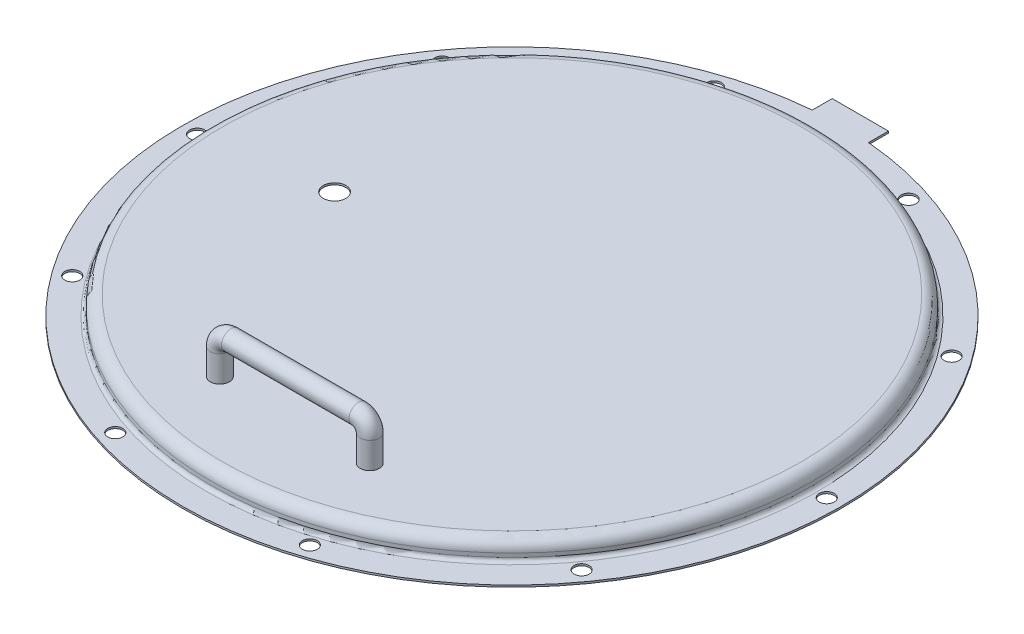
ISO-10303-21;
HEADER;
FILE_DESCRIPTION(('STEP AP214'),'2;1');
FILE_NAME('part.step','',(''),(''),'','','');
FILE_SCHEMA(('AUTOMOTIVE_DESIGN { 1 0 10303 214 1 1 1 1 }'));
ENDSEC;
DATA;
#1=APPLICATION_CONTEXT('core data for automotive mechanical design processes');
#2=APPLICATION_PROTOCOL_DEFINITION('international standard','automotive_design',2000,#1);
#3=PRODUCT_CONTEXT('',#1,'mechanical');
#4=PRODUCT('Part','Part','',(#3));
#5=PRODUCT_RELATED_PRODUCT_CATEGORY('part','',(#4));
#6=PRODUCT_DEFINITION_FORMATION('','',#4);
#7=PRODUCT_DEFINITION_CONTEXT('part definition',#1,'design');
#8=PRODUCT_DEFINITION('design','',#6,#7);
#9=PRODUCT_DEFINITION_SHAPE('','',#8);
#10=(LENGTH_UNIT() NAMED_UNIT(*) SI_UNIT(.MILLI.,.METRE.));
#11=(NAMED_UNIT(*) PLANE_ANGLE_UNIT() SI_UNIT($,.RADIAN.));
#12=(NAMED_UNIT(*) SI_UNIT($,.STERADIAN.) SOLID_ANGLE_UNIT());
#13=UNCERTAINTY_MEASURE_WITH_UNIT(LENGTH_MEASURE(1.E-05),#10,'distance_accuracy_value','');
#14=(GEOMETRIC_REPRESENTATION_CONTEXT(3) GLOBAL_UNCERTAINTY_ASSIGNED_CONTEXT((#13)) GLOBAL_UNIT_ASSIGNED_CONTEXT((#10,
#11,#12)) REPRESENTATION_CONTEXT('',''));
#15=CARTESIAN_POINT('',(0.,0.,0.));
#16=DIRECTION('',(0.,0.,1.));
#17=DIRECTION('',(1.,0.,0.));
#18=AXIS2_PLACEMENT_3D('',#15,#16,#17);
#19=CARTESIAN_POINT('',(200.,55.,579.2));
#20=DIRECTION('',(0.,1.,0.));
#21=DIRECTION('',(-1.,0.,0.));
#22=AXIS2_PLACEMENT_3D('',#19,#20,#21);
#23=PLANE('',#22);
#24=CARTESIAN_POINT('',(200.,55.,579.2));
#25=DIRECTION('',(0.,1.,0.));
#26=DIRECTION('',(-1.,0.,0.));
#27=AXIS2_PLACEMENT_3D('',#24,#25,#26);
#28=CIRCLE('',#27,25.4);
#29=CARTESIAN_POINT('',(174.6,55.,579.2));
#30=VERTEX_POINT('',#29);
#31=EDGE_CURVE('E68',#30,#30,#28,.T.);
#32=ORIENTED_EDGE('',*,*,#31,.F.);
#33=EDGE_LOOP('',(#32));
#34=FACE_BOUND('',#33,.T.);
#35=ADVANCED_FACE('F46',(#34),#23,.F.);
#36=CARTESIAN_POINT('',(-200.,55.,579.2));
#37=DIRECTION('',(0.,-1.,0.));
#38=DIRECTION('',(1.,0.,0.));
#39=AXIS2_PLACEMENT_3D('',#36,#37,#38);
#40=PLANE('',#39);
#41=CARTESIAN_POINT('',(-200.,55.,579.2));
#42=DIRECTION('',(0.,-1.,0.));
#43=DIRECTION('',(1.,0.,0.));
#44=AXIS2_PLACEMENT_3D('',#41,#42,#43);
#45=CIRCLE('',#44,25.4);
#46=CARTESIAN_POINT('',(-174.6,55.,579.2));
#47=VERTEX_POINT('',#46);
#48=EDGE_CURVE('E11',#47,#47,#45,.T.);
#49=ORIENTED_EDGE('',*,*,#48,.T.);
#50=EDGE_LOOP('',(#49));
#51=FACE_BOUND('',#50,.T.);
#52=ADVANCED_FACE('F75',(#51),#40,.T.);
#53=CARTESIAN_POINT('',(200.,55.,579.2));
#54=DIRECTION('',(0.,1.,0.));
#55=DIRECTION('',(0.,0.,1.));
#56=AXIS2_PLACEMENT_3D('',#53,#54,#55);
#57=CYLINDRICAL_SURFACE('',#56,25.4);
#58=CARTESIAN_POINT('',(200.,125.,579.2));
#59=DIRECTION('',(0.,1.,0.));
#60=DIRECTION('',(-1.,0.,0.));
#61=AXIS2_PLACEMENT_3D('',#58,#59,#60);
#62=CIRCLE('',#61,25.4);
#63=CARTESIAN_POINT('',(225.4,125.,579.2));
#64=VERTEX_POINT('',#63);
#65=EDGE_CURVE('E65',#64,#64,#62,.T.);
#66=ORIENTED_EDGE('',*,*,#65,.F.);
#67=EDGE_LOOP('',(#66));
#68=FACE_BOUND('',#67,.T.);
#69=ORIENTED_EDGE('',*,*,#31,.T.);
#70=EDGE_LOOP('',(#69));
#71=FACE_BOUND('',#70,.T.);
#72=ADVANCED_FACE('F72',(#68,#71),#57,.T.);
#73=CARTESIAN_POINT('',(170.,125.,579.2));
#74=DIRECTION('',(0.,0.,1.));
#75=DIRECTION('',(1.,0.,0.));
#76=AXIS2_PLACEMENT_3D('',#73,#74,#75);
#77=TOROIDAL_SURFACE('',#76,29.9999999999996,25.4);
#78=CARTESIAN_POINT('',(170.,155.,579.2));
#79=DIRECTION('',(-1.,0.,0.));
#80=DIRECTION('',(0.,-1.,0.));
#81=AXIS2_PLACEMENT_3D('',#78,#79,#80);
#82=CIRCLE('',#81,25.4);
#83=CARTESIAN_POINT('',(170.,180.4,579.2));
#84=VERTEX_POINT('',#83);
#85=EDGE_CURVE('E60',#84,#84,#82,.T.);
#86=CARTESIAN_POINT('',(170.,125.,579.2));
#87=DIRECTION('',(0.,0.,1.));
#88=DIRECTION('',(1.,0.,0.));
#89=AXIS2_PLACEMENT_3D('',#86,#87,#88);
#90=CIRCLE('',#89,55.3999999999996);
#91=EDGE_CURVE('',#64,#84,#90,.T.);
#92=ORIENTED_EDGE('',*,*,#65,.T.);
#93=ORIENTED_EDGE('',*,*,#85,.F.);
#94=ORIENTED_EDGE('',*,*,#91,.T.);
#95=ORIENTED_EDGE('',*,*,#91,.F.);
#96=EDGE_LOOP('',(#92,#94,#93,#95));
#97=FACE_BOUND('',#96,.T.);
#98=ADVANCED_FACE('F93',(#97),#77,.T.);
#99=CARTESIAN_POINT('',(170.,155.,579.2));
#100=DIRECTION('',(-1.,0.,0.));
#101=DIRECTION('',(0.,-1.,0.));
#102=AXIS2_PLACEMENT_3D('',#99,#100,#101);
#103=CYLINDRICAL_SURFACE('',#102,25.4);
#104=CARTESIAN_POINT('',(-170.,155.,579.2));
#105=DIRECTION('',(-1.,0.,0.));
#106=DIRECTION('',(0.,-1.,0.));
#107=AXIS2_PLACEMENT_3D('',#104,#105,#106);
#108=CIRCLE('',#107,25.4);
#109=CARTESIAN_POINT('',(-170.,180.4,579.2));
#110=VERTEX_POINT('',#109);
#111=EDGE_CURVE('E56',#110,#110,#108,.T.);
#112=ORIENTED_EDGE('',*,*,#111,.F.);
#113=EDGE_LOOP('',(#112));
#114=FACE_BOUND('',#113,.T.);
#115=ORIENTED_EDGE('',*,*,#85,.T.);
#116=EDGE_LOOP('',(#115));
#117=FACE_BOUND('',#116,.T.);
#118=ADVANCED_FACE('F87',(#114,#117),#103,.T.);
#119=CARTESIAN_POINT('',(-170.,125.,579.2));
#120=DIRECTION('',(0.,0.,1.));
#121=DIRECTION('',(1.,0.,0.));
#122=AXIS2_PLACEMENT_3D('',#119,#120,#121);
#123=TOROIDAL_SURFACE('',#122,30.,25.4);
#124=CARTESIAN_POINT('',(-200.,125.,579.2));
#125=DIRECTION('',(0.,-1.,0.));
#126=DIRECTION('',(1.,0.,0.));
#127=AXIS2_PLACEMENT_3D('',#124,#125,#126);
#128=CIRCLE('',#127,25.4);
#129=CARTESIAN_POINT('',(-225.4,125.,579.2));
#130=VERTEX_POINT('',#129);
#131=EDGE_CURVE('E52',#130,#130,#128,.T.);
#132=CARTESIAN_POINT('',(-170.,125.,579.2));
#133=DIRECTION('',(0.,0.,1.));
#134=DIRECTION('',(1.,0.,0.));
#135=AXIS2_PLACEMENT_3D('',#132,#133,#134);
#136=CIRCLE('',#135,55.4);
#137=EDGE_CURVE('',#110,#130,#136,.T.);
#138=ORIENTED_EDGE('',*,*,#111,.T.);
#139=ORIENTED_EDGE('',*,*,#131,.F.);
#140=ORIENTED_EDGE('',*,*,#137,.T.);
#141=ORIENTED_EDGE('',*,*,#137,.F.);
#142=EDGE_LOOP('',(#138,#140,#139,#141));
#143=FACE_BOUND('',#142,.T.);
#144=ADVANCED_FACE('F81',(#143),#123,.T.);
#145=CARTESIAN_POINT('',(-200.,125.,579.2));
#146=DIRECTION('',(0.,-1.,0.));
#147=DIRECTION('',(1.,0.,0.));
#148=AXIS2_PLACEMENT_3D('',#145,#146,#147);
#149=CYLINDRICAL_SURFACE('',#148,25.4);
#150=ORIENTED_EDGE('',*,*,#48,.F.);
#151=EDGE_LOOP('',(#150));
#152=FACE_BOUND('',#151,.T.);
#153=ORIENTED_EDGE('',*,*,#131,.T.);
#154=EDGE_LOOP('',(#153));
#155=FACE_BOUND('',#154,.T.);
#156=ADVANCED_FACE('F79',(#152,#155),#149,.T.);
#157=CLOSED_SHELL('',(#35,#52,#72,#98,#118,#144,#156));
#158=MANIFOLD_SOLID_BREP('B2',#157);
#159=CARTESIAN_POINT('',(0.,5.,0.));
#160=DIRECTION('',(0.,1.,0.));
#161=DIRECTION('',(0.,0.,1.));
#162=AXIS2_PLACEMENT_3D('',#159,#160,#161);
#163=PLANE('',#162);
#164=CARTESIAN_POINT('',(0.,5.,0.));
#165=DIRECTION('',(0.,1.,0.));
#166=DIRECTION('',(0.,0.,1.));
#167=AXIS2_PLACEMENT_3D('',#164,#165,#166);
#168=CIRCLE('',#167,813.);
#169=CARTESIAN_POINT('',(0.,5.,813.));
#170=VERTEX_POINT('',#169);
#171=EDGE_CURVE('E44',#170,#170,#168,.F.);
#172=ORIENTED_EDGE('',*,*,#171,.T.);
#173=EDGE_LOOP('',(#172));
#174=FACE_BOUND('',#173,.T.);
#175=CARTESIAN_POINT('',(259.450668477215,5.,-798.507051081408));
#176=DIRECTION('',(0.,1.,0.));
#177=DIRECTION('',(0.,0.,1.));
#178=AXIS2_PLACEMENT_3D('',#175,#176,#177);
#179=CIRCLE('',#178,20.0000000000001);
#180=CARTESIAN_POINT('',(259.450668477215,5.,-778.507051081408));
#181=VERTEX_POINT('',#180);
#182=EDGE_CURVE('E322',#181,#181,#179,.T.);
#183=ORIENTED_EDGE('',*,*,#182,.F.);
#184=EDGE_LOOP('',(#183));
#185=FACE_BOUND('',#184,.T.);
#186=CARTESIAN_POINT('',(-679.250668477202,5.,-493.504497824766));
#187=DIRECTION('',(0.,1.,0.));
#188=DIRECTION('',(0.,0.,1.));
#189=AXIS2_PLACEMENT_3D('',#186,#187,#188);
#190=CIRCLE('',#189,20.0000000000001);
#191=CARTESIAN_POINT('',(-679.250668477202,5.,-473.504497824766));
#192=VERTEX_POINT('',#191);
#193=EDGE_CURVE('E330',#192,#192,#190,.T.);
#194=ORIENTED_EDGE('',*,*,#193,.F.);
#195=EDGE_LOOP('',(#194));
#196=FACE_BOUND('',#195,.T.);
#197=CARTESIAN_POINT('',(-679.250668477209,5.,493.504497824757));
#198=DIRECTION('',(0.,1.,0.));
#199=DIRECTION('',(0.,0.,1.));
#200=AXIS2_PLACEMENT_3D('',#197,#198,#199);
#201=CIRCLE('',#200,20.0000000000001);
#202=CARTESIAN_POINT('',(-679.250668477209,5.,513.504497824757));
#203=VERTEX_POINT('',#202);
#204=EDGE_CURVE('E338',#203,#203,#201,.T.);
#205=ORIENTED_EDGE('',*,*,#204,.F.);
#206=EDGE_LOOP('',(#205));
#207=FACE_BOUND('',#206,.T.);
#208=CARTESIAN_POINT('',(259.450668477204,5.,798.507051081412));
#209=DIRECTION('',(0.,1.,0.));
#210=DIRECTION('',(0.,0.,1.));
#211=AXIS2_PLACEMENT_3D('',#208,#209,#210);
#212=CIRCLE('',#211,20.);
#213=CARTESIAN_POINT('',(259.450668477204,5.,818.507051081412));
#214=VERTEX_POINT('',#213);
#215=EDGE_CURVE('E346',#214,#214,#212,.T.);
#216=ORIENTED_EDGE('',*,*,#215,.F.);
#217=EDGE_LOOP('',(#216));
#218=FACE_BOUND('',#217,.T.);
#219=CARTESIAN_POINT('',(839.6,5.,0.));
#220=DIRECTION('',(0.,1.,0.));
#221=DIRECTION('',(0.,0.,1.));
#222=AXIS2_PLACEMENT_3D('',#219,#220,#221);
#223=CIRCLE('',#222,20.0000000000001);
#224=CARTESIAN_POINT('',(839.6,5.,20.0000000000001));
#225=VERTEX_POINT('',#224);
#226=EDGE_CURVE('E354',#225,#225,#223,.T.);
#227=ORIENTED_EDGE('',*,*,#226,.F.);
#228=EDGE_LOOP('',(#227));
#229=FACE_BOUND('',#228,.T.);
#230=DIRECTION('',(0.,0.,-1.));
#231=VECTOR('',#230,1.);
#232=CARTESIAN_POINT('',(75.0000000000001,5.,-875.995228297506));
#233=LINE('',#232,#231);
#234=CARTESIAN_POINT('',(74.9999999999993,5.,-875.995228297506));
#235=VERTEX_POINT('',#234);
#236=CARTESIAN_POINT('',(75.0000000000001,5.,-929.2));
#237=VERTEX_POINT('',#236);
#238=EDGE_CURVE('E199',#235,#237,#233,.T.);
#239=ORIENTED_EDGE('',*,*,#238,.T.);
#240=DIRECTION('',(-1.,0.,0.));
#241=VECTOR('',#240,1.);
#242=CARTESIAN_POINT('',(-74.9999999999999,5.,-929.2));
#243=LINE('',#242,#241);
#244=CARTESIAN_POINT('',(-74.9999999999999,5.,-929.2));
#245=VERTEX_POINT('',#244);
#246=EDGE_CURVE('E194',#237,#245,#243,.T.);
#247=ORIENTED_EDGE('',*,*,#246,.T.);
#248=DIRECTION('',(0.,0.,1.));
#249=VECTOR('',#248,1.);
#250=CARTESIAN_POINT('',(-74.9999999999999,5.,-875.995228297506));
#251=LINE('',#250,#249);
#252=CARTESIAN_POINT('',(-74.9999999999999,5.,-875.995228297506));
#253=VERTEX_POINT('',#252);
#254=EDGE_CURVE('E197',#245,#253,#251,.T.);
#255=ORIENTED_EDGE('',*,*,#254,.T.);
#256=CARTESIAN_POINT('',(0.,5.,0.));
#257=DIRECTION('',(0.,1.,0.));
#258=DIRECTION('',(0.,0.,1.));
#259=AXIS2_PLACEMENT_3D('',#256,#257,#258);
#260=CIRCLE('',#259,879.2);
#261=EDGE_CURVE('E163',#253,#235,#260,.T.);
#262=ORIENTED_EDGE('',*,*,#261,.T.);
#263=EDGE_LOOP('',(#239,#247,#255,#262));
#264=FACE_BOUND('',#263,.T.);
#265=CARTESIAN_POINT('',(679.250668477205,5.,493.504497824761));
#266=DIRECTION('',(0.,1.,0.));
#267=DIRECTION('',(0.,0.,1.));
#268=AXIS2_PLACEMENT_3D('',#265,#266,#267);
#269=CIRCLE('',#268,20.0000000000001);
#270=CARTESIAN_POINT('',(679.250668477205,5.,513.504497824762));
#271=VERTEX_POINT('',#270);
#272=EDGE_CURVE('E350',#271,#271,#269,.T.);
#273=ORIENTED_EDGE('',*,*,#272,.F.);
#274=EDGE_LOOP('',(#273));
#275=FACE_BOUND('',#274,.T.);
#276=CARTESIAN_POINT('',(-259.450668477209,5.,798.50705108141));
#277=DIRECTION('',(0.,1.,0.));
#278=DIRECTION('',(0.,0.,1.));
#279=AXIS2_PLACEMENT_3D('',#276,#277,#278);
#280=CIRCLE('',#279,20.0000000000001);
#281=CARTESIAN_POINT('',(-259.450668477209,5.,818.50705108141));
#282=VERTEX_POINT('',#281);
#283=EDGE_CURVE('E342',#282,#282,#280,.T.);
#284=ORIENTED_EDGE('',*,*,#283,.F.);
#285=EDGE_LOOP('',(#284));
#286=FACE_BOUND('',#285,.T.);
#287=CARTESIAN_POINT('',(-839.6,5.,-5.86289546418539E-12));
#288=DIRECTION('',(0.,1.,0.));
#289=DIRECTION('',(0.,0.,1.));
#290=AXIS2_PLACEMENT_3D('',#287,#288,#289);
#291=CIRCLE('',#290,20.);
#292=CARTESIAN_POINT('',(-839.6,5.,19.9999999999942));
#293=VERTEX_POINT('',#292);
#294=EDGE_CURVE('E334',#293,#293,#291,.T.);
#295=ORIENTED_EDGE('',*,*,#294,.F.);
#296=EDGE_LOOP('',(#295));
#297=FACE_BOUND('',#296,.T.);
#298=CARTESIAN_POINT('',(-259.450668477198,5.,-798.507051081413));
#299=DIRECTION('',(0.,1.,0.));
#300=DIRECTION('',(0.,0.,1.));
#301=AXIS2_PLACEMENT_3D('',#298,#299,#300);
#302=CIRCLE('',#301,20.0000000000002);
#303=CARTESIAN_POINT('',(-259.450668477198,5.,-778.507051081413));
#304=VERTEX_POINT('',#303);
#305=EDGE_CURVE('E326',#304,#304,#302,.T.);
#306=ORIENTED_EDGE('',*,*,#305,.F.);
#307=EDGE_LOOP('',(#306));
#308=FACE_BOUND('',#307,.T.);
#309=CARTESIAN_POINT('',(679.250668477212,5.,-493.504497824752));
#310=DIRECTION('',(0.,1.,0.));
#311=DIRECTION('',(0.,0.,1.));
#312=AXIS2_PLACEMENT_3D('',#309,#310,#311);
#313=CIRCLE('',#312,20.);
#314=CARTESIAN_POINT('',(679.250668477212,5.,-473.504497824752));
#315=VERTEX_POINT('',#314);
#316=EDGE_CURVE('E313',#315,#315,#313,.T.);
#317=ORIENTED_EDGE('',*,*,#316,.F.);
#318=EDGE_LOOP('',(#317));
#319=FACE_BOUND('',#318,.T.);
#320=ADVANCED_FACE('F146',(#174,#185,#196,#207,#218,#229,#264,#275,#286,#297,#308,#319),#163,.T.);
#321=CARTESIAN_POINT('',(0.,0.,0.));
#322=DIRECTION('',(0.,1.,0.));
#323=DIRECTION('',(0.,0.,1.));
#324=AXIS2_PLACEMENT_3D('',#321,#322,#323);
#325=PLANE('',#324);
#326=DIRECTION('',(0.,0.,-1.));
#327=VECTOR('',#326,1.);
#328=CARTESIAN_POINT('',(75.0000000000001,0.,-875.995228297506));
#329=LINE('',#328,#327);
#330=CARTESIAN_POINT('',(74.9999999999993,0.,-875.995228297506));
#331=VERTEX_POINT('',#330);
#332=CARTESIAN_POINT('',(75.0000000000001,0.,-929.2));
#333=VERTEX_POINT('',#332);
#334=EDGE_CURVE('E214',#331,#333,#329,.T.);
#335=ORIENTED_EDGE('',*,*,#334,.F.);
#336=CARTESIAN_POINT('',(0.,0.,0.));
#337=DIRECTION('',(0.,1.,0.));
#338=DIRECTION('',(0.,0.,1.));
#339=AXIS2_PLACEMENT_3D('',#336,#337,#338);
#340=CIRCLE('',#339,879.2);
#341=CARTESIAN_POINT('',(-74.9999999999999,0.,-875.995228297506));
#342=VERTEX_POINT('',#341);
#343=EDGE_CURVE('E186',#342,#331,#340,.T.);
#344=ORIENTED_EDGE('',*,*,#343,.F.);
#345=DIRECTION('',(0.,0.,1.));
#346=VECTOR('',#345,1.);
#347=CARTESIAN_POINT('',(-74.9999999999999,0.,-875.995228297506));
#348=LINE('',#347,#346);
#349=CARTESIAN_POINT('',(-74.9999999999999,0.,-929.2));
#350=VERTEX_POINT('',#349);
#351=EDGE_CURVE('E180',#350,#342,#348,.T.);
#352=ORIENTED_EDGE('',*,*,#351,.F.);
#353=DIRECTION('',(-1.,0.,0.));
#354=VECTOR('',#353,1.);
#355=CARTESIAN_POINT('',(-74.9999999999999,0.,-929.2));
#356=LINE('',#355,#354);
#357=EDGE_CURVE('E204',#333,#350,#356,.T.);
#358=ORIENTED_EDGE('',*,*,#357,.F.);
#359=EDGE_LOOP('',(#335,#344,#352,#358));
#360=FACE_BOUND('',#359,.T.);
#361=CARTESIAN_POINT('',(0.,0.,0.));
#362=DIRECTION('',(0.,1.,0.));
#363=DIRECTION('',(0.,0.,1.));
#364=AXIS2_PLACEMENT_3D('',#361,#362,#363);
#365=CIRCLE('',#364,800.);
#366=CARTESIAN_POINT('',(0.,0.,800.));
#367=VERTEX_POINT('',#366);
#368=EDGE_CURVE('E217',#367,#367,#365,.T.);
#369=ORIENTED_EDGE('',*,*,#368,.T.);
#370=EDGE_LOOP('',(#369));
#371=FACE_BOUND('',#370,.T.);
#372=CARTESIAN_POINT('',(839.6,0.,0.));
#373=DIRECTION('',(0.,1.,0.));
#374=DIRECTION('',(0.,0.,1.));
#375=AXIS2_PLACEMENT_3D('',#372,#373,#374);
#376=CIRCLE('',#375,20.0000000000001);
#377=CARTESIAN_POINT('',(839.6,0.,20.0000000000001));
#378=VERTEX_POINT('',#377);
#379=EDGE_CURVE('E276',#378,#378,#376,.T.);
#380=ORIENTED_EDGE('',*,*,#379,.T.);
#381=EDGE_LOOP('',(#380));
#382=FACE_BOUND('',#381,.T.);
#383=CARTESIAN_POINT('',(679.250668477205,0.,493.504497824761));
#384=DIRECTION('',(0.,1.,0.));
#385=DIRECTION('',(0.,0.,1.));
#386=AXIS2_PLACEMENT_3D('',#383,#384,#385);
#387=CIRCLE('',#386,20.0000000000001);
#388=CARTESIAN_POINT('',(679.250668477205,0.,513.504497824762));
#389=VERTEX_POINT('',#388);
#390=EDGE_CURVE('E280',#389,#389,#387,.T.);
#391=ORIENTED_EDGE('',*,*,#390,.T.);
#392=EDGE_LOOP('',(#391));
#393=FACE_BOUND('',#392,.T.);
#394=CARTESIAN_POINT('',(259.450668477204,0.,798.507051081412));
#395=DIRECTION('',(0.,1.,0.));
#396=DIRECTION('',(0.,0.,1.));
#397=AXIS2_PLACEMENT_3D('',#394,#395,#396);
#398=CIRCLE('',#397,20.);
#399=CARTESIAN_POINT('',(259.450668477204,0.,818.507051081412));
#400=VERTEX_POINT('',#399);
#401=EDGE_CURVE('E284',#400,#400,#398,.T.);
#402=ORIENTED_EDGE('',*,*,#401,.T.);
#403=EDGE_LOOP('',(#402));
#404=FACE_BOUND('',#403,.T.);
#405=CARTESIAN_POINT('',(-259.450668477209,0.,798.50705108141));
#406=DIRECTION('',(0.,1.,0.));
#407=DIRECTION('',(0.,0.,1.));
#408=AXIS2_PLACEMENT_3D('',#405,#406,#407);
#409=CIRCLE('',#408,20.0000000000001);
#410=CARTESIAN_POINT('',(-259.450668477209,0.,818.50705108141));
#411=VERTEX_POINT('',#410);
#412=EDGE_CURVE('E288',#411,#411,#409,.T.);
#413=ORIENTED_EDGE('',*,*,#412,.T.);
#414=EDGE_LOOP('',(#413));
#415=FACE_BOUND('',#414,.T.);
#416=CARTESIAN_POINT('',(-679.250668477209,0.,493.504497824757));
#417=DIRECTION('',(0.,1.,0.));
#418=DIRECTION('',(0.,0.,1.));
#419=AXIS2_PLACEMENT_3D('',#416,#417,#418);
#420=CIRCLE('',#419,20.0000000000001);
#421=CARTESIAN_POINT('',(-679.250668477209,0.,513.504497824757));
#422=VERTEX_POINT('',#421);
#423=EDGE_CURVE('E292',#422,#422,#420,.T.);
#424=ORIENTED_EDGE('',*,*,#423,.T.);
#425=EDGE_LOOP('',(#424));
#426=FACE_BOUND('',#425,.T.);
#427=CARTESIAN_POINT('',(-839.6,0.,-5.86289546418539E-12));
#428=DIRECTION('',(0.,1.,0.));
#429=DIRECTION('',(0.,0.,1.));
#430=AXIS2_PLACEMENT_3D('',#427,#428,#429);
#431=CIRCLE('',#430,20.);
#432=CARTESIAN_POINT('',(-839.6,0.,19.9999999999942));
#433=VERTEX_POINT('',#432);
#434=EDGE_CURVE('E296',#433,#433,#431,.T.);
#435=ORIENTED_EDGE('',*,*,#434,.T.);
#436=EDGE_LOOP('',(#435));
#437=FACE_BOUND('',#436,.T.);
#438=CARTESIAN_POINT('',(-679.250668477202,0.,-493.504497824766));
#439=DIRECTION('',(0.,1.,0.));
#440=DIRECTION('',(0.,0.,1.));
#441=AXIS2_PLACEMENT_3D('',#438,#439,#440);
#442=CIRCLE('',#441,20.0000000000001);
#443=CARTESIAN_POINT('',(-679.250668477202,0.,-473.504497824766));
#444=VERTEX_POINT('',#443);
#445=EDGE_CURVE('E300',#444,#444,#442,.T.);
#446=ORIENTED_EDGE('',*,*,#445,.T.);
#447=EDGE_LOOP('',(#446));
#448=FACE_BOUND('',#447,.T.);
#449=CARTESIAN_POINT('',(-259.450668477198,0.,-798.507051081413));
#450=DIRECTION('',(0.,1.,0.));
#451=DIRECTION('',(0.,0.,1.));
#452=AXIS2_PLACEMENT_3D('',#449,#450,#451);
#453=CIRCLE('',#452,20.0000000000002);
#454=CARTESIAN_POINT('',(-259.450668477198,0.,-778.507051081413));
#455=VERTEX_POINT('',#454);
#456=EDGE_CURVE('E304',#455,#455,#453,.T.);
#457=ORIENTED_EDGE('',*,*,#456,.T.);
#458=EDGE_LOOP('',(#457));
#459=FACE_BOUND('',#458,.T.);
#460=CARTESIAN_POINT('',(259.450668477215,0.,-798.507051081408));
#461=DIRECTION('',(0.,1.,0.));
#462=DIRECTION('',(0.,0.,1.));
#463=AXIS2_PLACEMENT_3D('',#460,#461,#462);
#464=CIRCLE('',#463,20.0000000000001);
#465=CARTESIAN_POINT('',(259.450668477215,0.,-778.507051081408));
#466=VERTEX_POINT('',#465);
#467=EDGE_CURVE('E308',#466,#466,#464,.T.);
#468=ORIENTED_EDGE('',*,*,#467,.T.);
#469=EDGE_LOOP('',(#468));
#470=FACE_BOUND('',#469,.T.);
#471=CARTESIAN_POINT('',(679.250668477212,0.,-493.504497824752));
#472=DIRECTION('',(0.,1.,0.));
#473=DIRECTION('',(0.,0.,1.));
#474=AXIS2_PLACEMENT_3D('',#471,#472,#473);
#475=CIRCLE('',#474,20.);
#476=CARTESIAN_POINT('',(679.250668477212,0.,-473.504497824752));
#477=VERTEX_POINT('',#476);
#478=EDGE_CURVE('E311',#477,#477,#475,.T.);
#479=ORIENTED_EDGE('',*,*,#478,.T.);
#480=EDGE_LOOP('',(#479));
#481=FACE_BOUND('',#480,.T.);
#482=ADVANCED_FACE('F244',(#360,#371,#382,#393,#404,#415,#426,#437,#448,#459,#470,#481),#325,.F.);
#483=CARTESIAN_POINT('',(75.0000000000001,5.,-875.995228297506));
#484=DIRECTION('',(-1.,0.,0.));
#485=DIRECTION('',(0.,0.,1.));
#486=AXIS2_PLACEMENT_3D('',#483,#484,#485);
#487=PLANE('',#486);
#488=ORIENTED_EDGE('',*,*,#334,.T.);
#489=DIRECTION('',(0.,-1.,0.));
#490=VECTOR('',#489,1.);
#491=CARTESIAN_POINT('',(75.0000000000001,5.,-929.2));
#492=LINE('',#491,#490);
#493=EDGE_CURVE('E205',#237,#333,#492,.T.);
#494=ORIENTED_EDGE('',*,*,#493,.F.);
#495=ORIENTED_EDGE('',*,*,#238,.F.);
#496=DIRECTION('',(0.,-1.,0.));
#497=VECTOR('',#496,1.);
#498=CARTESIAN_POINT('',(74.9999999999993,5.,-875.995228297506));
#499=LINE('',#498,#497);
#500=EDGE_CURVE('E210',#235,#331,#499,.T.);
#501=ORIENTED_EDGE('',*,*,#500,.T.);
#502=EDGE_LOOP('',(#488,#494,#495,#501));
#503=FACE_BOUND('',#502,.T.);
#504=ADVANCED_FACE('F250',(#503),#487,.F.);
#505=CARTESIAN_POINT('',(-74.9999999999999,5.,-929.2));
#506=DIRECTION('',(0.,0.,1.));
#507=DIRECTION('',(1.,0.,0.));
#508=AXIS2_PLACEMENT_3D('',#505,#506,#507);
#509=PLANE('',#508);
#510=ORIENTED_EDGE('',*,*,#357,.T.);
#511=DIRECTION('',(0.,-1.,0.));
#512=VECTOR('',#511,1.);
#513=CARTESIAN_POINT('',(-74.9999999999999,5.,-929.2));
#514=LINE('',#513,#512);
#515=EDGE_CURVE('E202',#245,#350,#514,.T.);
#516=ORIENTED_EDGE('',*,*,#515,.F.);
#517=ORIENTED_EDGE('',*,*,#246,.F.);
#518=ORIENTED_EDGE('',*,*,#493,.T.);
#519=EDGE_LOOP('',(#510,#516,#517,#518));
#520=FACE_BOUND('',#519,.T.);
#521=ADVANCED_FACE('F203',(#520),#509,.F.);
#522=CARTESIAN_POINT('',(-74.9999999999999,5.,-875.995228297506));
#523=DIRECTION('',(1.,0.,0.));
#524=DIRECTION('',(0.,0.,-1.));
#525=AXIS2_PLACEMENT_3D('',#522,#523,#524);
#526=PLANE('',#525);
#527=ORIENTED_EDGE('',*,*,#351,.T.);
#528=DIRECTION('',(0.,-1.,0.));
#529=VECTOR('',#528,1.);
#530=CARTESIAN_POINT('',(-74.9999999999999,5.,-875.995228297506));
#531=LINE('',#530,#529);
#532=EDGE_CURVE('E206',#253,#342,#531,.T.);
#533=ORIENTED_EDGE('',*,*,#532,.F.);
#534=ORIENTED_EDGE('',*,*,#254,.F.);
#535=ORIENTED_EDGE('',*,*,#515,.T.);
#536=EDGE_LOOP('',(#527,#533,#534,#535));
#537=FACE_BOUND('',#536,.T.);
#538=ADVANCED_FACE('F208',(#537),#526,.F.);
#539=CARTESIAN_POINT('',(0.,5.,0.));
#540=DIRECTION('',(0.,-1.,0.));
#541=DIRECTION('',(0.,0.,-1.));
#542=AXIS2_PLACEMENT_3D('',#539,#540,#541);
#543=CYLINDRICAL_SURFACE('',#542,879.2);
#544=ORIENTED_EDGE('',*,*,#343,.T.);
#545=ORIENTED_EDGE('',*,*,#500,.F.);
#546=ORIENTED_EDGE('',*,*,#261,.F.);
#547=ORIENTED_EDGE('',*,*,#532,.T.);
#548=EDGE_LOOP('',(#544,#545,#546,#547));
#549=FACE_BOUND('',#548,.T.);
#550=ADVANCED_FACE('F258',(#549),#543,.T.);
#551=CARTESIAN_POINT('',(0.,5.,0.));
#552=DIRECTION('',(0.,-1.,0.));
#553=DIRECTION('',(0.,0.,-1.));
#554=AXIS2_PLACEMENT_3D('',#551,#552,#553);
#555=CYLINDRICAL_SURFACE('',#554,800.);
#556=CARTESIAN_POINT('',(0.,5.,0.));
#557=DIRECTION('',(0.,-1.,0.));
#558=DIRECTION('',(1.,0.,0.));
#559=AXIS2_PLACEMENT_3D('',#556,#557,#558);
#560=CIRCLE('',#559,800.);
#561=CARTESIAN_POINT('',(800.,5.,0.));
#562=VERTEX_POINT('',#561);
#563=EDGE_CURVE('E314',#562,#562,#560,.T.);
#564=ORIENTED_EDGE('',*,*,#563,.F.);
#565=EDGE_LOOP('',(#564));
#566=FACE_BOUND('',#565,.T.);
#567=ORIENTED_EDGE('',*,*,#368,.F.);
#568=EDGE_LOOP('',(#567));
#569=FACE_BOUND('',#568,.T.);
#570=ADVANCED_FACE('F255',(#566,#569),#555,.F.);
#571=CARTESIAN_POINT('',(839.6,5.,0.));
#572=DIRECTION('',(0.,-1.,0.));
#573=DIRECTION('',(0.,0.,-1.));
#574=AXIS2_PLACEMENT_3D('',#571,#572,#573);
#575=CYLINDRICAL_SURFACE('',#574,20.0000000000001);
#576=ORIENTED_EDGE('',*,*,#226,.T.);
#577=EDGE_LOOP('',(#576));
#578=FACE_BOUND('',#577,.T.);
#579=ORIENTED_EDGE('',*,*,#379,.F.);
#580=EDGE_LOOP('',(#579));
#581=FACE_BOUND('',#580,.T.);
#582=ADVANCED_FACE('F360',(#578,#581),#575,.F.);
#583=CARTESIAN_POINT('',(679.250668477205,5.,493.504497824761));
#584=DIRECTION('',(0.,-1.,0.));
#585=DIRECTION('',(0.,0.,-1.));
#586=AXIS2_PLACEMENT_3D('',#583,#584,#585);
#587=CYLINDRICAL_SURFACE('',#586,20.0000000000001);
#588=ORIENTED_EDGE('',*,*,#272,.T.);
#589=EDGE_LOOP('',(#588));
#590=FACE_BOUND('',#589,.T.);
#591=ORIENTED_EDGE('',*,*,#390,.F.);
#592=EDGE_LOOP('',(#591));
#593=FACE_BOUND('',#592,.T.);
#594=ADVANCED_FACE('F364',(#590,#593),#587,.F.);
#595=CARTESIAN_POINT('',(259.450668477204,5.,798.507051081412));
#596=DIRECTION('',(0.,-1.,0.));
#597=DIRECTION('',(0.,0.,-1.));
#598=AXIS2_PLACEMENT_3D('',#595,#596,#597);
#599=CYLINDRICAL_SURFACE('',#598,20.);
#600=ORIENTED_EDGE('',*,*,#215,.T.);
#601=EDGE_LOOP('',(#600));
#602=FACE_BOUND('',#601,.T.);
#603=ORIENTED_EDGE('',*,*,#401,.F.);
#604=EDGE_LOOP('',(#603));
#605=FACE_BOUND('',#604,.T.);
#606=ADVANCED_FACE('F369',(#602,#605),#599,.F.);
#607=CARTESIAN_POINT('',(-259.450668477209,5.,798.50705108141));
#608=DIRECTION('',(0.,-1.,0.));
#609=DIRECTION('',(0.,0.,-1.));
#610=AXIS2_PLACEMENT_3D('',#607,#608,#609);
#611=CYLINDRICAL_SURFACE('',#610,20.0000000000001);
#612=ORIENTED_EDGE('',*,*,#283,.T.);
#613=EDGE_LOOP('',(#612));
#614=FACE_BOUND('',#613,.T.);
#615=ORIENTED_EDGE('',*,*,#412,.F.);
#616=EDGE_LOOP('',(#615));
#617=FACE_BOUND('',#616,.T.);
#618=ADVANCED_FACE('F376',(#614,#617),#611,.F.);
#619=CARTESIAN_POINT('',(-679.250668477209,5.,493.504497824757));
#620=DIRECTION('',(0.,-1.,0.));
#621=DIRECTION('',(0.,0.,-1.));
#622=AXIS2_PLACEMENT_3D('',#619,#620,#621);
#623=CYLINDRICAL_SURFACE('',#622,20.0000000000001);
#624=ORIENTED_EDGE('',*,*,#204,.T.);
#625=EDGE_LOOP('',(#624));
#626=FACE_BOUND('',#625,.T.);
#627=ORIENTED_EDGE('',*,*,#423,.F.);
#628=EDGE_LOOP('',(#627));
#629=FACE_BOUND('',#628,.T.);
#630=ADVANCED_FACE('F380',(#626,#629),#623,.F.);
#631=CARTESIAN_POINT('',(-839.6,5.,-5.86289546418539E-12));
#632=DIRECTION('',(0.,-1.,0.));
#633=DIRECTION('',(0.,0.,-1.));
#634=AXIS2_PLACEMENT_3D('',#631,#632,#633);
#635=CYLINDRICAL_SURFACE('',#634,20.);
#636=ORIENTED_EDGE('',*,*,#294,.T.);
#637=EDGE_LOOP('',(#636));
#638=FACE_BOUND('',#637,.T.);
#639=ORIENTED_EDGE('',*,*,#434,.F.);
#640=EDGE_LOOP('',(#639));
#641=FACE_BOUND('',#640,.T.);
#642=ADVANCED_FACE('F384',(#638,#641),#635,.F.);
#643=CARTESIAN_POINT('',(-679.250668477202,5.,-493.504497824766));
#644=DIRECTION('',(0.,-1.,0.));
#645=DIRECTION('',(0.,0.,-1.));
#646=AXIS2_PLACEMENT_3D('',#643,#644,#645);
#647=CYLINDRICAL_SURFACE('',#646,20.0000000000001);
#648=ORIENTED_EDGE('',*,*,#193,.T.);
#649=EDGE_LOOP('',(#648));
#650=FACE_BOUND('',#649,.T.);
#651=ORIENTED_EDGE('',*,*,#445,.F.);
#652=EDGE_LOOP('',(#651));
#653=FACE_BOUND('',#652,.T.);
#654=ADVANCED_FACE('F388',(#650,#653),#647,.F.);
#655=CARTESIAN_POINT('',(-259.450668477198,5.,-798.507051081413));
#656=DIRECTION('',(0.,-1.,0.));
#657=DIRECTION('',(0.,0.,-1.));
#658=AXIS2_PLACEMENT_3D('',#655,#656,#657);
#659=CYLINDRICAL_SURFACE('',#658,20.0000000000002);
#660=ORIENTED_EDGE('',*,*,#305,.T.);
#661=EDGE_LOOP('',(#660));
#662=FACE_BOUND('',#661,.T.);
#663=ORIENTED_EDGE('',*,*,#456,.F.);
#664=EDGE_LOOP('',(#663));
#665=FACE_BOUND('',#664,.T.);
#666=ADVANCED_FACE('F392',(#662,#665),#659,.F.);
#667=CARTESIAN_POINT('',(259.450668477215,5.,-798.507051081408));
#668=DIRECTION('',(0.,-1.,0.));
#669=DIRECTION('',(0.,0.,-1.));
#670=AXIS2_PLACEMENT_3D('',#667,#668,#669);
#671=CYLINDRICAL_SURFACE('',#670,20.0000000000001);
#672=ORIENTED_EDGE('',*,*,#182,.T.);
#673=EDGE_LOOP('',(#672));
#674=FACE_BOUND('',#673,.T.);
#675=ORIENTED_EDGE('',*,*,#467,.F.);
#676=EDGE_LOOP('',(#675));
#677=FACE_BOUND('',#676,.T.);
#678=ADVANCED_FACE('F396',(#674,#677),#671,.F.);
#679=CARTESIAN_POINT('',(679.250668477212,5.,-493.504497824752));
#680=DIRECTION('',(0.,-1.,0.));
#681=DIRECTION('',(0.,0.,-1.));
#682=AXIS2_PLACEMENT_3D('',#679,#680,#681);
#683=CYLINDRICAL_SURFACE('',#682,20.);
#684=ORIENTED_EDGE('',*,*,#316,.T.);
#685=EDGE_LOOP('',(#684));
#686=FACE_BOUND('',#685,.T.);
#687=ORIENTED_EDGE('',*,*,#478,.F.);
#688=EDGE_LOOP('',(#687));
#689=FACE_BOUND('',#688,.T.);
#690=ADVANCED_FACE('F400',(#686,#689),#683,.F.);
#691=CARTESIAN_POINT('',(0.,0.,0.));
#692=DIRECTION('',(0.,-1.,0.));
#693=DIRECTION('',(1.,0.,0.));
#694=AXIS2_PLACEMENT_3D('',#691,#692,#693);
#695=CYLINDRICAL_SURFACE('',#694,798.);
#696=CARTESIAN_POINT('',(0.,5.,0.));
#697=DIRECTION('',(0.,-1.,0.));
#698=DIRECTION('',(1.,0.,0.));
#699=AXIS2_PLACEMENT_3D('',#696,#697,#698);
#700=CIRCLE('',#699,798.);
#701=CARTESIAN_POINT('',(798.,5.,0.));
#702=VERTEX_POINT('',#701);
#703=EDGE_CURVE('E430',#702,#702,#700,.T.);
#704=ORIENTED_EDGE('',*,*,#703,.T.);
#705=EDGE_LOOP('',(#704));
#706=FACE_BOUND('',#705,.T.);
#707=CARTESIAN_POINT('',(0.,19.9999999999998,0.));
#708=DIRECTION('',(0.,-1.,0.));
#709=DIRECTION('',(1.,0.,0.));
#710=AXIS2_PLACEMENT_3D('',#707,#708,#709);
#711=CIRCLE('',#710,798.);
#712=CARTESIAN_POINT('',(798.,19.9999999999998,0.));
#713=VERTEX_POINT('',#712);
#714=EDGE_CURVE('E433',#713,#713,#711,.T.);
#715=ORIENTED_EDGE('',*,*,#714,.F.);
#716=EDGE_LOOP('',(#715));
#717=FACE_BOUND('',#716,.T.);
#718=ADVANCED_FACE('F404',(#706,#717),#695,.F.);
#719=CARTESIAN_POINT('',(0.,20.,0.));
#720=DIRECTION('',(0.,-1.,0.));
#721=DIRECTION('',(1.,0.,0.));
#722=AXIS2_PLACEMENT_3D('',#719,#720,#721);
#723=TOROIDAL_SURFACE('',#722,768.,30.);
#724=ORIENTED_EDGE('',*,*,#714,.T.);
#725=EDGE_LOOP('',(#724));
#726=FACE_BOUND('',#725,.T.);
#727=CARTESIAN_POINT('',(0.,50.,0.));
#728=DIRECTION('',(0.,-1.,0.));
#729=DIRECTION('',(1.,0.,0.));
#730=AXIS2_PLACEMENT_3D('',#727,#728,#729);
#731=CIRCLE('',#730,768.);
#732=CARTESIAN_POINT('',(768.,50.,0.));
#733=VERTEX_POINT('',#732);
#734=EDGE_CURVE('E434',#733,#733,#731,.T.);
#735=ORIENTED_EDGE('',*,*,#734,.F.);
#736=EDGE_LOOP('',(#735));
#737=FACE_BOUND('',#736,.T.);
#738=ADVANCED_FACE('F418',(#726,#737),#723,.F.);
#739=CARTESIAN_POINT('',(768.,50.,0.));
#740=DIRECTION('',(0.,-1.,0.));
#741=DIRECTION('',(1.,0.,0.));
#742=AXIS2_PLACEMENT_3D('',#739,#740,#741);
#743=PLANE('',#742);
#744=CARTESIAN_POINT('',(-473.,50.,0.));
#745=DIRECTION('',(0.,-1.,0.));
#746=DIRECTION('',(1.,0.,0.));
#747=AXIS2_PLACEMENT_3D('',#744,#745,#746);
#748=CIRCLE('',#747,30.);
#749=CARTESIAN_POINT('',(-443.,50.,0.));
#750=VERTEX_POINT('',#749);
#751=EDGE_CURVE('E439',#750,#750,#748,.T.);
#752=ORIENTED_EDGE('',*,*,#751,.F.);
#753=EDGE_LOOP('',(#752));
#754=FACE_BOUND('',#753,.T.);
#755=ORIENTED_EDGE('',*,*,#734,.T.);
#756=EDGE_LOOP('',(#755));
#757=FACE_BOUND('',#756,.T.);
#758=ADVANCED_FACE('F409',(#754,#757),#743,.T.);
#759=CARTESIAN_POINT('',(798.,5.,0.));
#760=DIRECTION('',(0.,-1.,0.));
#761=DIRECTION('',(1.,0.,0.));
#762=AXIS2_PLACEMENT_3D('',#759,#760,#761);
#763=PLANE('',#762);
#764=ORIENTED_EDGE('',*,*,#703,.F.);
#765=EDGE_LOOP('',(#764));
#766=FACE_BOUND('',#765,.T.);
#767=ORIENTED_EDGE('',*,*,#563,.T.);
#768=EDGE_LOOP('',(#767));
#769=FACE_BOUND('',#768,.T.);
#770=ADVANCED_FACE('F406',(#766,#769),#763,.T.);
#771=CARTESIAN_POINT('',(0.,0.,0.));
#772=DIRECTION('',(0.,-1.,0.));
#773=DIRECTION('',(1.,0.,0.));
#774=AXIS2_PLACEMENT_3D('',#771,#772,#773);
#775=CYLINDRICAL_SURFACE('',#774,803.);
#776=CARTESIAN_POINT('',(0.,15.,0.));
#777=DIRECTION('',(0.,1.,0.));
#778=DIRECTION('',(0.,0.,1.));
#779=AXIS2_PLACEMENT_3D('',#776,#777,#778);
#780=CIRCLE('',#779,803.);
#781=CARTESIAN_POINT('',(0.,15.,803.));
#782=VERTEX_POINT('',#781);
#783=EDGE_CURVE('E155',#782,#782,#780,.T.);
#784=ORIENTED_EDGE('',*,*,#783,.T.);
#785=EDGE_LOOP('',(#784));
#786=FACE_BOUND('',#785,.T.);
#787=CARTESIAN_POINT('',(0.,24.9999999999998,0.));
#788=DIRECTION('',(0.,-1.,0.));
#789=DIRECTION('',(1.,0.,0.));
#790=AXIS2_PLACEMENT_3D('',#787,#788,#789);
#791=CIRCLE('',#790,803.);
#792=CARTESIAN_POINT('',(803.,24.9999999999998,0.));
#793=VERTEX_POINT('',#792);
#794=EDGE_CURVE('E319',#793,#793,#791,.T.);
#795=ORIENTED_EDGE('',*,*,#794,.T.);
#796=EDGE_LOOP('',(#795));
#797=FACE_BOUND('',#796,.T.);
#798=ADVANCED_FACE('F226',(#786,#797),#775,.T.);
#799=CARTESIAN_POINT('',(0.,25.,0.));
#800=DIRECTION('',(0.,-1.,0.));
#801=DIRECTION('',(1.,0.,0.));
#802=AXIS2_PLACEMENT_3D('',#799,#800,#801);
#803=TOROIDAL_SURFACE('',#802,773.,30.);
#804=CARTESIAN_POINT('',(0.,55.,0.));
#805=DIRECTION('',(0.,-1.,0.));
#806=DIRECTION('',(1.,0.,0.));
#807=AXIS2_PLACEMENT_3D('',#804,#805,#806);
#808=CIRCLE('',#807,773.);
#809=CARTESIAN_POINT('',(773.,55.,0.));
#810=VERTEX_POINT('',#809);
#811=EDGE_CURVE('E437',#810,#810,#808,.T.);
#812=ORIENTED_EDGE('',*,*,#811,.T.);
#813=EDGE_LOOP('',(#812));
#814=FACE_BOUND('',#813,.T.);
#815=ORIENTED_EDGE('',*,*,#794,.F.);
#816=EDGE_LOOP('',(#815));
#817=FACE_BOUND('',#816,.T.);
#818=ADVANCED_FACE('F239',(#814,#817),#803,.T.);
#819=CARTESIAN_POINT('',(773.,55.,0.));
#820=DIRECTION('',(0.,1.,0.));
#821=DIRECTION('',(-1.,0.,0.));
#822=AXIS2_PLACEMENT_3D('',#819,#820,#821);
#823=PLANE('',#822);
#824=CARTESIAN_POINT('',(-473.,55.,0.));
#825=DIRECTION('',(0.,1.,0.));
#826=DIRECTION('',(-1.,0.,0.));
#827=AXIS2_PLACEMENT_3D('',#824,#825,#826);
#828=CIRCLE('',#827,30.);
#829=CARTESIAN_POINT('',(-503.,55.,0.));
#830=VERTEX_POINT('',#829);
#831=EDGE_CURVE('E452',#830,#830,#828,.T.);
#832=ORIENTED_EDGE('',*,*,#831,.F.);
#833=EDGE_LOOP('',(#832));
#834=FACE_BOUND('',#833,.T.);
#835=ORIENTED_EDGE('',*,*,#811,.F.);
#836=EDGE_LOOP('',(#835));
#837=FACE_BOUND('',#836,.T.);
#838=ADVANCED_FACE('F231',(#834,#837),#823,.T.);
#839=CARTESIAN_POINT('',(0.,15.,0.));
#840=DIRECTION('',(0.,1.,0.));
#841=DIRECTION('',(0.,0.,1.));
#842=AXIS2_PLACEMENT_3D('',#839,#840,#841);
#843=TOROIDAL_SURFACE('',#842,813.,10.);
#844=ORIENTED_EDGE('',*,*,#171,.F.);
#845=EDGE_LOOP('',(#844));
#846=FACE_BOUND('',#845,.T.);
#847=ORIENTED_EDGE('',*,*,#783,.F.);
#848=EDGE_LOOP('',(#847));
#849=FACE_BOUND('',#848,.T.);
#850=ADVANCED_FACE('F148',(#846,#849),#843,.F.);
#851=CARTESIAN_POINT('',(-473.,4.99999999999995,0.));
#852=DIRECTION('',(0.,1.,0.));
#853=DIRECTION('',(-1.,0.,0.));
#854=AXIS2_PLACEMENT_3D('',#851,#852,#853);
#855=CYLINDRICAL_SURFACE('',#854,30.);
#856=ORIENTED_EDGE('',*,*,#751,.T.);
#857=EDGE_LOOP('',(#856));
#858=FACE_BOUND('',#857,.T.);
#859=ORIENTED_EDGE('',*,*,#831,.T.);
#860=EDGE_LOOP('',(#859));
#861=FACE_BOUND('',#860,.T.);
#862=ADVANCED_FACE('F230',(#858,#861),#855,.F.);
#863=CLOSED_SHELL('',(#320,#482,#504,#521,#538,#550,#570,#582,#594,#606,#618,#630,#642,#654,
#666,#678,#690,#718,#738,#758,#770,#798,#818,#838,#850,#862));
#864=MANIFOLD_SOLID_BREP('B6',#863);
#865=ADVANCED_BREP_SHAPE_REPRESENTATION('',(#18,#158,#864),#14);
#866=SHAPE_DEFINITION_REPRESENTATION(#9,#865);
ENDSEC;
END-ISO-10303-21;
